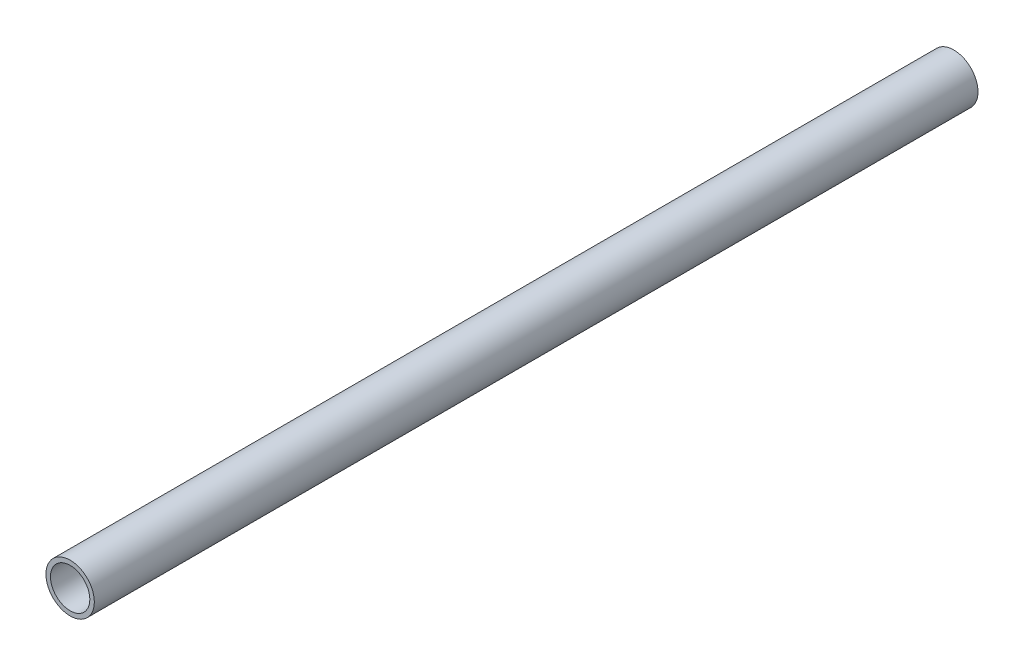
ISO-10303-21;
HEADER;
FILE_DESCRIPTION(('STEP AP214'),'2;1');
FILE_NAME('part.step','',(''),(''),'','','');
FILE_SCHEMA(('AUTOMOTIVE_DESIGN { 1 0 10303 214 1 1 1 1 }'));
ENDSEC;
DATA;
#1=APPLICATION_CONTEXT('core data for automotive mechanical design processes');
#2=APPLICATION_PROTOCOL_DEFINITION('international standard','automotive_design',2000,#1);
#3=PRODUCT_CONTEXT('',#1,'mechanical');
#4=PRODUCT('Part','Part','',(#3));
#5=PRODUCT_RELATED_PRODUCT_CATEGORY('part','',(#4));
#6=PRODUCT_DEFINITION_FORMATION('','',#4);
#7=PRODUCT_DEFINITION_CONTEXT('part definition',#1,'design');
#8=PRODUCT_DEFINITION('design','',#6,#7);
#9=PRODUCT_DEFINITION_SHAPE('','',#8);
#10=(LENGTH_UNIT() NAMED_UNIT(*) SI_UNIT(.MILLI.,.METRE.));
#11=(NAMED_UNIT(*) PLANE_ANGLE_UNIT() SI_UNIT($,.RADIAN.));
#12=(NAMED_UNIT(*) SI_UNIT($,.STERADIAN.) SOLID_ANGLE_UNIT());
#13=UNCERTAINTY_MEASURE_WITH_UNIT(LENGTH_MEASURE(1.E-05),#10,'distance_accuracy_value','');
#14=(GEOMETRIC_REPRESENTATION_CONTEXT(3) GLOBAL_UNCERTAINTY_ASSIGNED_CONTEXT((#13)) GLOBAL_UNIT_ASSIGNED_CONTEXT((#10,
#11,#12)) REPRESENTATION_CONTEXT('',''));
#15=CARTESIAN_POINT('',(0.,0.,0.));
#16=DIRECTION('',(0.,0.,1.));
#17=DIRECTION('',(1.,0.,0.));
#18=AXIS2_PLACEMENT_3D('',#15,#16,#17);
#19=CARTESIAN_POINT('',(0.,0.,174.));
#20=DIRECTION('',(0.,0.,1.));
#21=DIRECTION('',(1.,0.,0.));
#22=AXIS2_PLACEMENT_3D('',#19,#20,#21);
#23=PLANE('',#22);
#24=CARTESIAN_POINT('',(0.,0.,174.));
#25=DIRECTION('',(0.,0.,1.));
#26=DIRECTION('',(1.,0.,0.));
#27=AXIS2_PLACEMENT_3D('',#24,#25,#26);
#28=CIRCLE('',#27,4.7625);
#29=CARTESIAN_POINT('',(4.7625,0.,174.));
#30=VERTEX_POINT('',#29);
#31=EDGE_CURVE('E10',#30,#30,#28,.T.);
#32=ORIENTED_EDGE('',*,*,#31,.T.);
#33=EDGE_LOOP('',(#32));
#34=FACE_BOUND('',#33,.T.);
#35=CARTESIAN_POINT('',(0.,0.,174.));
#36=DIRECTION('',(0.,0.,1.));
#37=DIRECTION('',(1.,0.,0.));
#38=AXIS2_PLACEMENT_3D('',#35,#36,#37);
#39=CIRCLE('',#38,3.8735);
#40=CARTESIAN_POINT('',(3.8735,0.,174.));
#41=VERTEX_POINT('',#40);
#42=EDGE_CURVE('E54',#41,#41,#39,.T.);
#43=ORIENTED_EDGE('',*,*,#42,.F.);
#44=EDGE_LOOP('',(#43));
#45=FACE_BOUND('',#44,.T.);
#46=ADVANCED_FACE('F41',(#34,#45),#23,.T.);
#47=CARTESIAN_POINT('',(0.,0.,0.));
#48=DIRECTION('',(0.,0.,1.));
#49=DIRECTION('',(1.,0.,0.));
#50=AXIS2_PLACEMENT_3D('',#47,#48,#49);
#51=PLANE('',#50);
#52=CARTESIAN_POINT('',(0.,0.,0.));
#53=DIRECTION('',(0.,0.,1.));
#54=DIRECTION('',(1.,0.,0.));
#55=AXIS2_PLACEMENT_3D('',#52,#53,#54);
#56=CIRCLE('',#55,4.7625);
#57=CARTESIAN_POINT('',(4.7625,0.,0.));
#58=VERTEX_POINT('',#57);
#59=EDGE_CURVE('E45',#58,#58,#56,.T.);
#60=ORIENTED_EDGE('',*,*,#59,.F.);
#61=EDGE_LOOP('',(#60));
#62=FACE_BOUND('',#61,.T.);
#63=CARTESIAN_POINT('',(0.,0.,0.));
#64=DIRECTION('',(0.,0.,1.));
#65=DIRECTION('',(1.,0.,0.));
#66=AXIS2_PLACEMENT_3D('',#63,#64,#65);
#67=CIRCLE('',#66,3.8735);
#68=CARTESIAN_POINT('',(3.8735,0.,0.));
#69=VERTEX_POINT('',#68);
#70=EDGE_CURVE('E56',#69,#69,#67,.T.);
#71=ORIENTED_EDGE('',*,*,#70,.T.);
#72=EDGE_LOOP('',(#71));
#73=FACE_BOUND('',#72,.T.);
#74=ADVANCED_FACE('F68',(#62,#73),#51,.F.);
#75=CARTESIAN_POINT('',(0.,0.,174.));
#76=DIRECTION('',(0.,0.,-1.));
#77=DIRECTION('',(-1.,0.,0.));
#78=AXIS2_PLACEMENT_3D('',#75,#76,#77);
#79=CYLINDRICAL_SURFACE('',#78,4.7625);
#80=ORIENTED_EDGE('',*,*,#31,.F.);
#81=EDGE_LOOP('',(#80));
#82=FACE_BOUND('',#81,.T.);
#83=ORIENTED_EDGE('',*,*,#59,.T.);
#84=EDGE_LOOP('',(#83));
#85=FACE_BOUND('',#84,.T.);
#86=ADVANCED_FACE('F43',(#82,#85),#79,.T.);
#87=CARTESIAN_POINT('',(0.,0.,174.));
#88=DIRECTION('',(0.,0.,-1.));
#89=DIRECTION('',(-1.,0.,0.));
#90=AXIS2_PLACEMENT_3D('',#87,#88,#89);
#91=CYLINDRICAL_SURFACE('',#90,3.8735);
#92=ORIENTED_EDGE('',*,*,#42,.T.);
#93=EDGE_LOOP('',(#92));
#94=FACE_BOUND('',#93,.T.);
#95=ORIENTED_EDGE('',*,*,#70,.F.);
#96=EDGE_LOOP('',(#95));
#97=FACE_BOUND('',#96,.T.);
#98=ADVANCED_FACE('F64',(#94,#97),#91,.F.);
#99=CLOSED_SHELL('',(#46,#74,#86,#98));
#100=MANIFOLD_SOLID_BREP('B2',#99);
#101=ADVANCED_BREP_SHAPE_REPRESENTATION('',(#18,#100),#14);
#102=SHAPE_DEFINITION_REPRESENTATION(#9,#101);
ENDSEC;
END-ISO-10303-21;
